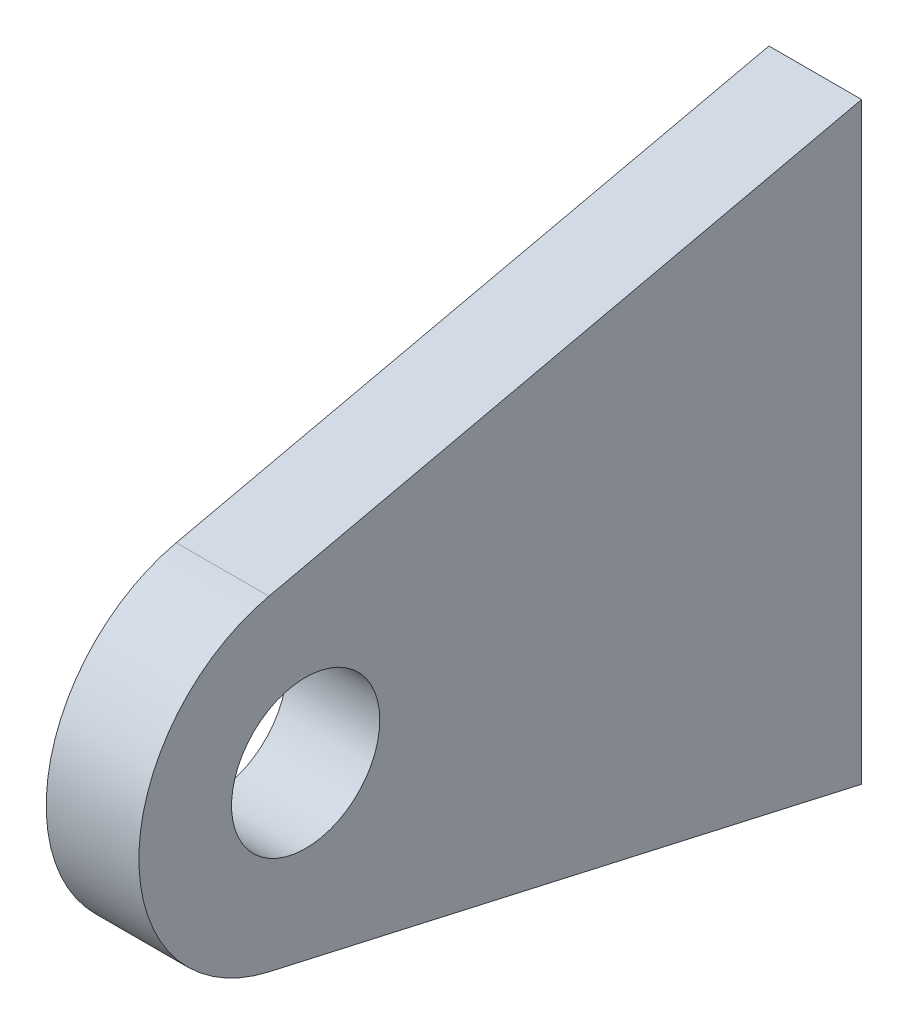
ISO-10303-21;
HEADER;
FILE_DESCRIPTION(('STEP AP214'),'2;1');
FILE_NAME('part.step','',(''),(''),'','','');
FILE_SCHEMA(('AUTOMOTIVE_DESIGN { 1 0 10303 214 1 1 1 1 }'));
ENDSEC;
DATA;
#1=APPLICATION_CONTEXT('core data for automotive mechanical design processes');
#2=APPLICATION_PROTOCOL_DEFINITION('international standard','automotive_design',2000,#1);
#3=PRODUCT_CONTEXT('',#1,'mechanical');
#4=PRODUCT('Part','Part','',(#3));
#5=PRODUCT_RELATED_PRODUCT_CATEGORY('part','',(#4));
#6=PRODUCT_DEFINITION_FORMATION('','',#4);
#7=PRODUCT_DEFINITION_CONTEXT('part definition',#1,'design');
#8=PRODUCT_DEFINITION('design','',#6,#7);
#9=PRODUCT_DEFINITION_SHAPE('','',#8);
#10=(LENGTH_UNIT() NAMED_UNIT(*) SI_UNIT(.MILLI.,.METRE.));
#11=(NAMED_UNIT(*) PLANE_ANGLE_UNIT() SI_UNIT($,.RADIAN.));
#12=(NAMED_UNIT(*) SI_UNIT($,.STERADIAN.) SOLID_ANGLE_UNIT());
#13=UNCERTAINTY_MEASURE_WITH_UNIT(LENGTH_MEASURE(1.E-05),#10,'distance_accuracy_value','');
#14=(GEOMETRIC_REPRESENTATION_CONTEXT(3) GLOBAL_UNCERTAINTY_ASSIGNED_CONTEXT((#13)) GLOBAL_UNIT_ASSIGNED_CONTEXT((#10,
#11,#12)) REPRESENTATION_CONTEXT('',''));
#15=CARTESIAN_POINT('',(0.,0.,0.));
#16=DIRECTION('',(0.,0.,1.));
#17=DIRECTION('',(1.,0.,0.));
#18=AXIS2_PLACEMENT_3D('',#15,#16,#17);
#19=CARTESIAN_POINT('',(2.5,0.,30.));
#20=DIRECTION('',(1.,0.,0.));
#21=DIRECTION('',(0.,0.,-1.));
#22=AXIS2_PLACEMENT_3D('',#19,#20,#21);
#23=PLANE('',#22);
#24=DIRECTION('',(0.,-0.220237960159308,0.975446175298703));
#25=VECTOR('',#24,1.);
#26=CARTESIAN_POINT('',(2.5,16.,0.));
#27=LINE('',#26,#25);
#28=CARTESIAN_POINT('',(2.5,16.,0.));
#29=VERTEX_POINT('',#28);
#30=CARTESIAN_POINT('',(2.5,8.77901557768833,31.9821416414338));
#31=VERTEX_POINT('',#30);
#32=EDGE_CURVE('E90',#29,#31,#27,.T.);
#33=ORIENTED_EDGE('',*,*,#32,.T.);
#34=CARTESIAN_POINT('',(2.5,0.,30.));
#35=DIRECTION('',(1.,0.,0.));
#36=DIRECTION('',(0.,0.,-1.));
#37=AXIS2_PLACEMENT_3D('',#34,#35,#36);
#38=CIRCLE('',#37,9.00000000000001);
#39=CARTESIAN_POINT('',(2.5,-8.77901557768833,31.9821416414338));
#40=VERTEX_POINT('',#39);
#41=EDGE_CURVE('E85',#31,#40,#38,.T.);
#42=ORIENTED_EDGE('',*,*,#41,.T.);
#43=DIRECTION('',(0.,-0.220237960159308,-0.975446175298703));
#44=VECTOR('',#43,1.);
#45=CARTESIAN_POINT('',(2.5,-16.,0.));
#46=LINE('',#45,#44);
#47=CARTESIAN_POINT('',(2.5,-16.,0.));
#48=VERTEX_POINT('',#47);
#49=EDGE_CURVE('E88',#40,#48,#46,.T.);
#50=ORIENTED_EDGE('',*,*,#49,.T.);
#51=DIRECTION('',(0.,1.,0.));
#52=VECTOR('',#51,1.);
#53=CARTESIAN_POINT('',(2.5,-16.,0.));
#54=LINE('',#53,#52);
#55=EDGE_CURVE('E55',#48,#29,#54,.T.);
#56=ORIENTED_EDGE('',*,*,#55,.T.);
#57=EDGE_LOOP('',(#33,#42,#50,#56));
#58=FACE_BOUND('',#57,.T.);
#59=CARTESIAN_POINT('',(2.5,0.,30.));
#60=DIRECTION('',(1.,0.,0.));
#61=DIRECTION('',(0.,0.,-1.));
#62=AXIS2_PLACEMENT_3D('',#59,#60,#61);
#63=CIRCLE('',#62,4.);
#64=CARTESIAN_POINT('',(2.5,0.,26.));
#65=VERTEX_POINT('',#64);
#66=EDGE_CURVE('E105',#65,#65,#63,.T.);
#67=ORIENTED_EDGE('',*,*,#66,.F.);
#68=EDGE_LOOP('',(#67));
#69=FACE_BOUND('',#68,.T.);
#70=ADVANCED_FACE('F38',(#58,#69),#23,.T.);
#71=CARTESIAN_POINT('',(-2.5,0.,30.));
#72=DIRECTION('',(1.,0.,0.));
#73=DIRECTION('',(0.,0.,-1.));
#74=AXIS2_PLACEMENT_3D('',#71,#72,#73);
#75=PLANE('',#74);
#76=DIRECTION('',(0.,-0.220237960159308,0.975446175298703));
#77=VECTOR('',#76,1.);
#78=CARTESIAN_POINT('',(-2.5,16.,0.));
#79=LINE('',#78,#77);
#80=CARTESIAN_POINT('',(-2.5,16.,0.));
#81=VERTEX_POINT('',#80);
#82=CARTESIAN_POINT('',(-2.5,8.77901557768833,31.9821416414338));
#83=VERTEX_POINT('',#82);
#84=EDGE_CURVE('E102',#81,#83,#79,.T.);
#85=ORIENTED_EDGE('',*,*,#84,.F.);
#86=DIRECTION('',(0.,1.,0.));
#87=VECTOR('',#86,1.);
#88=CARTESIAN_POINT('',(-2.5,-16.,0.));
#89=LINE('',#88,#87);
#90=CARTESIAN_POINT('',(-2.5,-16.,0.));
#91=VERTEX_POINT('',#90);
#92=EDGE_CURVE('E78',#91,#81,#89,.T.);
#93=ORIENTED_EDGE('',*,*,#92,.F.);
#94=DIRECTION('',(0.,-0.220237960159308,-0.975446175298703));
#95=VECTOR('',#94,1.);
#96=CARTESIAN_POINT('',(-2.5,-16.,0.));
#97=LINE('',#96,#95);
#98=CARTESIAN_POINT('',(-2.5,-8.77901557768833,31.9821416414338));
#99=VERTEX_POINT('',#98);
#100=EDGE_CURVE('E72',#99,#91,#97,.T.);
#101=ORIENTED_EDGE('',*,*,#100,.F.);
#102=CARTESIAN_POINT('',(-2.5,0.,30.));
#103=DIRECTION('',(1.,0.,0.));
#104=DIRECTION('',(0.,0.,-1.));
#105=AXIS2_PLACEMENT_3D('',#102,#103,#104);
#106=CIRCLE('',#105,9.00000000000001);
#107=EDGE_CURVE('E94',#83,#99,#106,.T.);
#108=ORIENTED_EDGE('',*,*,#107,.F.);
#109=EDGE_LOOP('',(#85,#93,#101,#108));
#110=FACE_BOUND('',#109,.T.);
#111=CARTESIAN_POINT('',(-2.5,0.,30.));
#112=DIRECTION('',(1.,0.,0.));
#113=DIRECTION('',(0.,0.,-1.));
#114=AXIS2_PLACEMENT_3D('',#111,#112,#113);
#115=CIRCLE('',#114,4.);
#116=CARTESIAN_POINT('',(-2.5,0.,26.));
#117=VERTEX_POINT('',#116);
#118=EDGE_CURVE('E117',#117,#117,#115,.T.);
#119=ORIENTED_EDGE('',*,*,#118,.T.);
#120=EDGE_LOOP('',(#119));
#121=FACE_BOUND('',#120,.T.);
#122=ADVANCED_FACE('F113',(#110,#121),#75,.F.);
#123=CARTESIAN_POINT('',(2.5,16.,0.));
#124=DIRECTION('',(0.,-0.975446175298703,-0.220237960159308));
#125=DIRECTION('',(0.,0.220237960159308,-0.975446175298703));
#126=AXIS2_PLACEMENT_3D('',#123,#124,#125);
#127=PLANE('',#126);
#128=ORIENTED_EDGE('',*,*,#84,.T.);
#129=DIRECTION('',(-1.,0.,0.));
#130=VECTOR('',#129,1.);
#131=CARTESIAN_POINT('',(2.5,8.77901557768833,31.9821416414338));
#132=LINE('',#131,#130);
#133=EDGE_CURVE('E11',#31,#83,#132,.T.);
#134=ORIENTED_EDGE('',*,*,#133,.F.);
#135=ORIENTED_EDGE('',*,*,#32,.F.);
#136=DIRECTION('',(-1.,0.,0.));
#137=VECTOR('',#136,1.);
#138=CARTESIAN_POINT('',(2.5,16.,0.));
#139=LINE('',#138,#137);
#140=EDGE_CURVE('E98',#29,#81,#139,.T.);
#141=ORIENTED_EDGE('',*,*,#140,.T.);
#142=EDGE_LOOP('',(#128,#134,#135,#141));
#143=FACE_BOUND('',#142,.T.);
#144=ADVANCED_FACE('F40',(#143),#127,.F.);
#145=CARTESIAN_POINT('',(2.5,0.,30.));
#146=DIRECTION('',(-1.,0.,0.));
#147=DIRECTION('',(0.,0.,1.));
#148=AXIS2_PLACEMENT_3D('',#145,#146,#147);
#149=CYLINDRICAL_SURFACE('',#148,9.00000000000001);
#150=ORIENTED_EDGE('',*,*,#107,.T.);
#151=DIRECTION('',(-1.,0.,0.));
#152=VECTOR('',#151,1.);
#153=CARTESIAN_POINT('',(2.5,-8.77901557768833,31.9821416414338));
#154=LINE('',#153,#152);
#155=EDGE_CURVE('E47',#40,#99,#154,.T.);
#156=ORIENTED_EDGE('',*,*,#155,.F.);
#157=ORIENTED_EDGE('',*,*,#41,.F.);
#158=ORIENTED_EDGE('',*,*,#133,.T.);
#159=EDGE_LOOP('',(#150,#156,#157,#158));
#160=FACE_BOUND('',#159,.T.);
#161=ADVANCED_FACE('F93',(#160),#149,.T.);
#162=CARTESIAN_POINT('',(2.5,-16.,0.));
#163=DIRECTION('',(0.,0.975446175298703,-0.220237960159308));
#164=DIRECTION('',(0.,0.220237960159308,0.975446175298703));
#165=AXIS2_PLACEMENT_3D('',#162,#163,#164);
#166=PLANE('',#165);
#167=ORIENTED_EDGE('',*,*,#100,.T.);
#168=DIRECTION('',(-1.,0.,0.));
#169=VECTOR('',#168,1.);
#170=CARTESIAN_POINT('',(2.5,-16.,0.));
#171=LINE('',#170,#169);
#172=EDGE_CURVE('E95',#48,#91,#171,.T.);
#173=ORIENTED_EDGE('',*,*,#172,.F.);
#174=ORIENTED_EDGE('',*,*,#49,.F.);
#175=ORIENTED_EDGE('',*,*,#155,.T.);
#176=EDGE_LOOP('',(#167,#173,#174,#175));
#177=FACE_BOUND('',#176,.T.);
#178=ADVANCED_FACE('F96',(#177),#166,.F.);
#179=CARTESIAN_POINT('',(2.5,-16.,0.));
#180=DIRECTION('',(0.,0.,1.));
#181=DIRECTION('',(0.,-1.,0.));
#182=AXIS2_PLACEMENT_3D('',#179,#180,#181);
#183=PLANE('',#182);
#184=ORIENTED_EDGE('',*,*,#92,.T.);
#185=ORIENTED_EDGE('',*,*,#140,.F.);
#186=ORIENTED_EDGE('',*,*,#55,.F.);
#187=ORIENTED_EDGE('',*,*,#172,.T.);
#188=EDGE_LOOP('',(#184,#185,#186,#187));
#189=FACE_BOUND('',#188,.T.);
#190=ADVANCED_FACE('F110',(#189),#183,.F.);
#191=CARTESIAN_POINT('',(2.5,0.,30.));
#192=DIRECTION('',(-1.,0.,0.));
#193=DIRECTION('',(0.,0.,1.));
#194=AXIS2_PLACEMENT_3D('',#191,#192,#193);
#195=CYLINDRICAL_SURFACE('',#194,4.);
#196=ORIENTED_EDGE('',*,*,#66,.T.);
#197=EDGE_LOOP('',(#196));
#198=FACE_BOUND('',#197,.T.);
#199=ORIENTED_EDGE('',*,*,#118,.F.);
#200=EDGE_LOOP('',(#199));
#201=FACE_BOUND('',#200,.T.);
#202=ADVANCED_FACE('F123',(#198,#201),#195,.F.);
#203=CLOSED_SHELL('',(#70,#122,#144,#161,#178,#190,#202));
#204=MANIFOLD_SOLID_BREP('B2',#203);
#205=ADVANCED_BREP_SHAPE_REPRESENTATION('',(#18,#204),#14);
#206=SHAPE_DEFINITION_REPRESENTATION(#9,#205);
ENDSEC;
END-ISO-10303-21;
